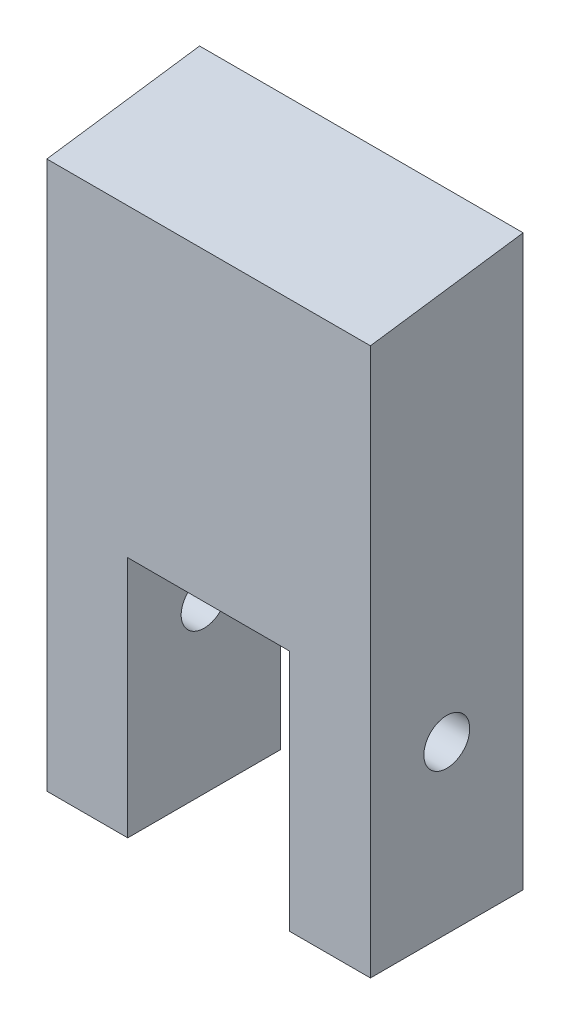
ISO-10303-21;
HEADER;
FILE_DESCRIPTION(('STEP AP214'),'2;1');
FILE_NAME('part.step','',(''),(''),'','','');
FILE_SCHEMA(('AUTOMOTIVE_DESIGN { 1 0 10303 214 1 1 1 1 }'));
ENDSEC;
DATA;
#1=APPLICATION_CONTEXT('core data for automotive mechanical design processes');
#2=APPLICATION_PROTOCOL_DEFINITION('international standard','automotive_design',2000,#1);
#3=PRODUCT_CONTEXT('',#1,'mechanical');
#4=PRODUCT('Part','Part','',(#3));
#5=PRODUCT_RELATED_PRODUCT_CATEGORY('part','',(#4));
#6=PRODUCT_DEFINITION_FORMATION('','',#4);
#7=PRODUCT_DEFINITION_CONTEXT('part definition',#1,'design');
#8=PRODUCT_DEFINITION('design','',#6,#7);
#9=PRODUCT_DEFINITION_SHAPE('','',#8);
#10=(LENGTH_UNIT() NAMED_UNIT(*) SI_UNIT(.MILLI.,.METRE.));
#11=(NAMED_UNIT(*) PLANE_ANGLE_UNIT() SI_UNIT($,.RADIAN.));
#12=(NAMED_UNIT(*) SI_UNIT($,.STERADIAN.) SOLID_ANGLE_UNIT());
#13=UNCERTAINTY_MEASURE_WITH_UNIT(LENGTH_MEASURE(1.E-05),#10,'distance_accuracy_value','');
#14=(GEOMETRIC_REPRESENTATION_CONTEXT(3) GLOBAL_UNCERTAINTY_ASSIGNED_CONTEXT((#13)) GLOBAL_UNIT_ASSIGNED_CONTEXT((#10,
#11,#12)) REPRESENTATION_CONTEXT('',''));
#15=CARTESIAN_POINT('',(0.,0.,0.));
#16=DIRECTION('',(0.,0.,1.));
#17=DIRECTION('',(1.,0.,0.));
#18=AXIS2_PLACEMENT_3D('',#15,#16,#17);
#19=CARTESIAN_POINT('',(25.4,0.,0.));
#20=DIRECTION('',(0.,1.,0.));
#21=DIRECTION('',(0.,0.,1.));
#22=AXIS2_PLACEMENT_3D('',#19,#20,#21);
#23=PLANE('',#22);
#24=DIRECTION('',(-1.,0.,0.));
#25=VECTOR('',#24,1.);
#26=CARTESIAN_POINT('',(25.4,0.,0.));
#27=LINE('',#26,#25);
#28=CARTESIAN_POINT('',(25.4,0.,0.));
#29=VERTEX_POINT('',#28);
#30=CARTESIAN_POINT('',(19.05,0.,0.));
#31=VERTEX_POINT('',#30);
#32=EDGE_CURVE('E11',#29,#31,#27,.T.);
#33=ORIENTED_EDGE('',*,*,#32,.T.);
#34=DIRECTION('',(0.,0.,1.));
#35=VECTOR('',#34,1.);
#36=CARTESIAN_POINT('',(19.05,0.,-11.9888));
#37=LINE('',#36,#35);
#38=CARTESIAN_POINT('',(19.05,0.,-11.9888));
#39=VERTEX_POINT('',#38);
#40=EDGE_CURVE('E153',#39,#31,#37,.T.);
#41=ORIENTED_EDGE('',*,*,#40,.F.);
#42=DIRECTION('',(-1.,0.,0.));
#43=VECTOR('',#42,1.);
#44=CARTESIAN_POINT('',(25.4,0.,-11.9888));
#45=LINE('',#44,#43);
#46=CARTESIAN_POINT('',(25.4,0.,-11.9888));
#47=VERTEX_POINT('',#46);
#48=EDGE_CURVE('E136',#47,#39,#45,.T.);
#49=ORIENTED_EDGE('',*,*,#48,.F.);
#50=DIRECTION('',(0.,0.,-1.));
#51=VECTOR('',#50,1.);
#52=CARTESIAN_POINT('',(25.4,0.,0.));
#53=LINE('',#52,#51);
#54=EDGE_CURVE('E92',#29,#47,#53,.T.);
#55=ORIENTED_EDGE('',*,*,#54,.F.);
#56=EDGE_LOOP('',(#33,#41,#49,#55));
#57=FACE_BOUND('',#56,.T.);
#58=ADVANCED_FACE('F39',(#57),#23,.F.);
#59=CARTESIAN_POINT('',(25.4,42.9782303930708,0.));
#60=DIRECTION('',(0.,0.,-1.));
#61=DIRECTION('',(0.,1.,0.));
#62=AXIS2_PLACEMENT_3D('',#59,#60,#61);
#63=PLANE('',#62);
#64=DIRECTION('',(-1.,0.,0.));
#65=VECTOR('',#64,1.);
#66=CARTESIAN_POINT('',(6.34999999999999,19.05,0.));
#67=LINE('',#66,#65);
#68=CARTESIAN_POINT('',(19.05,19.05,0.));
#69=VERTEX_POINT('',#68);
#70=CARTESIAN_POINT('',(6.34999999999999,19.05,0.));
#71=VERTEX_POINT('',#70);
#72=EDGE_CURVE('E141',#69,#71,#67,.T.);
#73=ORIENTED_EDGE('',*,*,#72,.F.);
#74=DIRECTION('',(0.,1.,0.));
#75=VECTOR('',#74,1.);
#76=CARTESIAN_POINT('',(19.05,19.05,0.));
#77=LINE('',#76,#75);
#78=EDGE_CURVE('E120',#31,#69,#77,.T.);
#79=ORIENTED_EDGE('',*,*,#78,.F.);
#80=ORIENTED_EDGE('',*,*,#32,.F.);
#81=DIRECTION('',(0.,-1.,0.));
#82=VECTOR('',#81,1.);
#83=CARTESIAN_POINT('',(25.4,42.9782303930708,0.));
#84=LINE('',#83,#82);
#85=CARTESIAN_POINT('',(25.4,42.9782303930708,0.));
#86=VERTEX_POINT('',#85);
#87=EDGE_CURVE('E163',#86,#29,#84,.T.);
#88=ORIENTED_EDGE('',*,*,#87,.F.);
#89=DIRECTION('',(-1.,0.,0.));
#90=VECTOR('',#89,1.);
#91=CARTESIAN_POINT('',(25.4,42.9782303930708,0.));
#92=LINE('',#91,#90);
#93=CARTESIAN_POINT('',(0.,42.9782303930708,0.));
#94=VERTEX_POINT('',#93);
#95=EDGE_CURVE('E173',#86,#94,#92,.T.);
#96=ORIENTED_EDGE('',*,*,#95,.T.);
#97=DIRECTION('',(0.,-1.,0.));
#98=VECTOR('',#97,1.);
#99=CARTESIAN_POINT('',(0.,42.9782303930708,0.));
#100=LINE('',#99,#98);
#101=CARTESIAN_POINT('',(0.,0.,0.));
#102=VERTEX_POINT('',#101);
#103=EDGE_CURVE('E156',#94,#102,#100,.T.);
#104=ORIENTED_EDGE('',*,*,#103,.T.);
#105=CARTESIAN_POINT('',(6.35,0.,0.));
#106=VERTEX_POINT('',#105);
#107=EDGE_CURVE('E48',#106,#102,#27,.T.);
#108=ORIENTED_EDGE('',*,*,#107,.F.);
#109=DIRECTION('',(0.,-1.,0.));
#110=VECTOR('',#109,1.);
#111=CARTESIAN_POINT('',(6.34999999999999,19.05,0.));
#112=LINE('',#111,#110);
#113=EDGE_CURVE('E138',#71,#106,#112,.T.);
#114=ORIENTED_EDGE('',*,*,#113,.F.);
#115=EDGE_LOOP('',(#73,#79,#80,#88,#96,#104,#108,#114));
#116=FACE_BOUND('',#115,.T.);
#117=ADVANCED_FACE('F41',(#116),#63,.F.);
#118=CARTESIAN_POINT('',(6.35,0.,-11.9888));
#119=VERTEX_POINT('',#118);
#120=CARTESIAN_POINT('',(0.,0.,-11.9888));
#121=VERTEX_POINT('',#120);
#122=EDGE_CURVE('E190',#119,#121,#45,.T.);
#123=ORIENTED_EDGE('',*,*,#122,.F.);
#124=DIRECTION('',(0.,0.,1.));
#125=VECTOR('',#124,1.);
#126=CARTESIAN_POINT('',(6.35,0.,-11.9888));
#127=LINE('',#126,#125);
#128=EDGE_CURVE('E157',#119,#106,#127,.T.);
#129=ORIENTED_EDGE('',*,*,#128,.T.);
#130=ORIENTED_EDGE('',*,*,#107,.T.);
#131=DIRECTION('',(0.,0.,-1.));
#132=VECTOR('',#131,1.);
#133=CARTESIAN_POINT('',(0.,0.,0.));
#134=LINE('',#133,#132);
#135=EDGE_CURVE('E177',#102,#121,#134,.T.);
#136=ORIENTED_EDGE('',*,*,#135,.T.);
#137=EDGE_LOOP('',(#123,#129,#130,#136));
#138=FACE_BOUND('',#137,.T.);
#139=ADVANCED_FACE('F199',(#138),#23,.F.);
#140=CARTESIAN_POINT('',(25.4,0.,-11.9888));
#141=DIRECTION('',(0.,0.,1.));
#142=DIRECTION('',(1.,0.,0.));
#143=AXIS2_PLACEMENT_3D('',#140,#141,#142);
#144=PLANE('',#143);
#145=ORIENTED_EDGE('',*,*,#48,.T.);
#146=DIRECTION('',(0.,1.,0.));
#147=VECTOR('',#146,1.);
#148=CARTESIAN_POINT('',(19.05,19.05,-11.9888));
#149=LINE('',#148,#147);
#150=CARTESIAN_POINT('',(19.05,19.05,-11.9888));
#151=VERTEX_POINT('',#150);
#152=EDGE_CURVE('E117',#39,#151,#149,.T.);
#153=ORIENTED_EDGE('',*,*,#152,.T.);
#154=DIRECTION('',(-1.,0.,0.));
#155=VECTOR('',#154,1.);
#156=CARTESIAN_POINT('',(6.34999999999999,19.05,-11.9888));
#157=LINE('',#156,#155);
#158=CARTESIAN_POINT('',(6.34999999999999,19.05,-11.9888));
#159=VERTEX_POINT('',#158);
#160=EDGE_CURVE('E128',#151,#159,#157,.T.);
#161=ORIENTED_EDGE('',*,*,#160,.T.);
#162=DIRECTION('',(0.,-1.,0.));
#163=VECTOR('',#162,1.);
#164=CARTESIAN_POINT('',(6.34999999999999,19.05,-11.9888));
#165=LINE('',#164,#163);
#166=EDGE_CURVE('E55',#159,#119,#165,.T.);
#167=ORIENTED_EDGE('',*,*,#166,.T.);
#168=ORIENTED_EDGE('',*,*,#122,.T.);
#169=DIRECTION('',(0.,1.,0.));
#170=VECTOR('',#169,1.);
#171=CARTESIAN_POINT('',(0.,0.,-11.9888));
#172=LINE('',#171,#170);
#173=CARTESIAN_POINT('',(0.,44.6631463521507,-11.9888));
#174=VERTEX_POINT('',#173);
#175=EDGE_CURVE('E181',#121,#174,#172,.T.);
#176=ORIENTED_EDGE('',*,*,#175,.T.);
#177=DIRECTION('',(-1.,0.,0.));
#178=VECTOR('',#177,1.);
#179=CARTESIAN_POINT('',(25.4,44.6631463521507,-11.9888));
#180=LINE('',#179,#178);
#181=CARTESIAN_POINT('',(25.4,44.6631463521507,-11.9888));
#182=VERTEX_POINT('',#181);
#183=EDGE_CURVE('E188',#182,#174,#180,.T.);
#184=ORIENTED_EDGE('',*,*,#183,.F.);
#185=DIRECTION('',(0.,1.,0.));
#186=VECTOR('',#185,1.);
#187=CARTESIAN_POINT('',(25.4,0.,-11.9888));
#188=LINE('',#187,#186);
#189=EDGE_CURVE('E168',#47,#182,#188,.T.);
#190=ORIENTED_EDGE('',*,*,#189,.F.);
#191=EDGE_LOOP('',(#145,#153,#161,#167,#168,#176,#184,#190));
#192=FACE_BOUND('',#191,.T.);
#193=ADVANCED_FACE('F134',(#192),#144,.F.);
#194=CARTESIAN_POINT('',(25.4,44.6631463521507,-11.9888));
#195=DIRECTION('',(0.,-0.990268068741571,-0.139173100960059));
#196=DIRECTION('',(0.,0.139173100960059,-0.990268068741571));
#197=AXIS2_PLACEMENT_3D('',#194,#195,#196);
#198=PLANE('',#197);
#199=DIRECTION('',(0.,-0.139173100960059,0.990268068741571));
#200=VECTOR('',#199,1.);
#201=CARTESIAN_POINT('',(0.,44.6631463521507,-11.9888));
#202=LINE('',#201,#200);
#203=EDGE_CURVE('E85',#174,#94,#202,.T.);
#204=ORIENTED_EDGE('',*,*,#203,.T.);
#205=ORIENTED_EDGE('',*,*,#95,.F.);
#206=DIRECTION('',(0.,-0.139173100960059,0.990268068741571));
#207=VECTOR('',#206,1.);
#208=CARTESIAN_POINT('',(25.4,44.6631463521507,-11.9888));
#209=LINE('',#208,#207);
#210=EDGE_CURVE('E64',#182,#86,#209,.T.);
#211=ORIENTED_EDGE('',*,*,#210,.F.);
#212=ORIENTED_EDGE('',*,*,#183,.T.);
#213=EDGE_LOOP('',(#204,#205,#211,#212));
#214=FACE_BOUND('',#213,.T.);
#215=ADVANCED_FACE('F208',(#214),#198,.F.);
#216=CARTESIAN_POINT('',(25.4,0.,0.));
#217=DIRECTION('',(1.,0.,0.));
#218=DIRECTION('',(0.,0.,-1.));
#219=AXIS2_PLACEMENT_3D('',#216,#217,#218);
#220=PLANE('',#219);
#221=CARTESIAN_POINT('',(25.4,13.0556,-5.9944));
#222=DIRECTION('',(1.,0.,0.));
#223=DIRECTION('',(0.,0.,-1.));
#224=AXIS2_PLACEMENT_3D('',#221,#222,#223);
#225=CIRCLE('',#224,1.79999999999999);
#226=CARTESIAN_POINT('',(25.4,13.0556,-7.79439999999999));
#227=VERTEX_POINT('',#226);
#228=EDGE_CURVE('E247',#227,#227,#225,.T.);
#229=ORIENTED_EDGE('',*,*,#228,.F.);
#230=EDGE_LOOP('',(#229));
#231=FACE_BOUND('',#230,.T.);
#232=ORIENTED_EDGE('',*,*,#87,.T.);
#233=ORIENTED_EDGE('',*,*,#54,.T.);
#234=ORIENTED_EDGE('',*,*,#189,.T.);
#235=ORIENTED_EDGE('',*,*,#210,.T.);
#236=EDGE_LOOP('',(#232,#233,#234,#235));
#237=FACE_BOUND('',#236,.T.);
#238=ADVANCED_FACE('F209',(#231,#237),#220,.T.);
#239=CARTESIAN_POINT('',(0.,0.,0.));
#240=DIRECTION('',(1.,0.,0.));
#241=DIRECTION('',(0.,0.,-1.));
#242=AXIS2_PLACEMENT_3D('',#239,#240,#241);
#243=PLANE('',#242);
#244=CARTESIAN_POINT('',(0.,13.0556,-5.9944));
#245=DIRECTION('',(1.,0.,0.));
#246=DIRECTION('',(0.,0.,-1.));
#247=AXIS2_PLACEMENT_3D('',#244,#245,#246);
#248=CIRCLE('',#247,1.79999999999999);
#249=CARTESIAN_POINT('',(0.,13.0556,-7.79439999999999));
#250=VERTEX_POINT('',#249);
#251=EDGE_CURVE('E250',#250,#250,#248,.T.);
#252=ORIENTED_EDGE('',*,*,#251,.T.);
#253=EDGE_LOOP('',(#252));
#254=FACE_BOUND('',#253,.T.);
#255=ORIENTED_EDGE('',*,*,#103,.F.);
#256=ORIENTED_EDGE('',*,*,#203,.F.);
#257=ORIENTED_EDGE('',*,*,#175,.F.);
#258=ORIENTED_EDGE('',*,*,#135,.F.);
#259=EDGE_LOOP('',(#255,#256,#257,#258));
#260=FACE_BOUND('',#259,.T.);
#261=ADVANCED_FACE('F203',(#254,#260),#243,.F.);
#262=CARTESIAN_POINT('',(19.05,19.05,-11.9888));
#263=DIRECTION('',(1.,0.,0.));
#264=DIRECTION('',(0.,1.,0.));
#265=AXIS2_PLACEMENT_3D('',#262,#263,#264);
#266=PLANE('',#265);
#267=CARTESIAN_POINT('',(19.05,13.0556,-5.9944));
#268=DIRECTION('',(1.,0.,0.));
#269=DIRECTION('',(0.,1.,0.));
#270=AXIS2_PLACEMENT_3D('',#267,#268,#269);
#271=CIRCLE('',#270,1.79999999999999);
#272=CARTESIAN_POINT('',(19.05,14.8556,-5.9944));
#273=VERTEX_POINT('',#272);
#274=EDGE_CURVE('E254',#273,#273,#271,.T.);
#275=ORIENTED_EDGE('',*,*,#274,.T.);
#276=EDGE_LOOP('',(#275));
#277=FACE_BOUND('',#276,.T.);
#278=ORIENTED_EDGE('',*,*,#78,.T.);
#279=DIRECTION('',(0.,0.,1.));
#280=VECTOR('',#279,1.);
#281=CARTESIAN_POINT('',(19.05,19.05,-11.9888));
#282=LINE('',#281,#280);
#283=EDGE_CURVE('E113',#151,#69,#282,.T.);
#284=ORIENTED_EDGE('',*,*,#283,.F.);
#285=ORIENTED_EDGE('',*,*,#152,.F.);
#286=ORIENTED_EDGE('',*,*,#40,.T.);
#287=EDGE_LOOP('',(#278,#284,#285,#286));
#288=FACE_BOUND('',#287,.T.);
#289=ADVANCED_FACE('F115',(#277,#288),#266,.F.);
#290=CARTESIAN_POINT('',(6.34999999999999,19.05,-11.9888));
#291=DIRECTION('',(-1.,0.,0.));
#292=DIRECTION('',(0.,-1.,0.));
#293=AXIS2_PLACEMENT_3D('',#290,#291,#292);
#294=PLANE('',#293);
#295=CARTESIAN_POINT('',(6.34999999999999,13.0556,-5.9944));
#296=DIRECTION('',(-1.,0.,0.));
#297=DIRECTION('',(0.,-1.,0.));
#298=AXIS2_PLACEMENT_3D('',#295,#296,#297);
#299=CIRCLE('',#298,1.79999999999999);
#300=CARTESIAN_POINT('',(6.34999999999999,11.2556,-5.9944));
#301=VERTEX_POINT('',#300);
#302=EDGE_CURVE('E144',#301,#301,#299,.T.);
#303=ORIENTED_EDGE('',*,*,#302,.T.);
#304=EDGE_LOOP('',(#303));
#305=FACE_BOUND('',#304,.T.);
#306=ORIENTED_EDGE('',*,*,#113,.T.);
#307=ORIENTED_EDGE('',*,*,#128,.F.);
#308=ORIENTED_EDGE('',*,*,#166,.F.);
#309=DIRECTION('',(0.,0.,1.));
#310=VECTOR('',#309,1.);
#311=CARTESIAN_POINT('',(6.34999999999999,19.05,-11.9888));
#312=LINE('',#311,#310);
#313=EDGE_CURVE('E125',#159,#71,#312,.T.);
#314=ORIENTED_EDGE('',*,*,#313,.T.);
#315=EDGE_LOOP('',(#306,#307,#308,#314));
#316=FACE_BOUND('',#315,.T.);
#317=ADVANCED_FACE('F210',(#305,#316),#294,.F.);
#318=CARTESIAN_POINT('',(6.34999999999999,19.05,-11.9888));
#319=DIRECTION('',(0.,1.,0.));
#320=DIRECTION('',(-1.,0.,0.));
#321=AXIS2_PLACEMENT_3D('',#318,#319,#320);
#322=PLANE('',#321);
#323=ORIENTED_EDGE('',*,*,#72,.T.);
#324=ORIENTED_EDGE('',*,*,#313,.F.);
#325=ORIENTED_EDGE('',*,*,#160,.F.);
#326=ORIENTED_EDGE('',*,*,#283,.T.);
#327=EDGE_LOOP('',(#323,#324,#325,#326));
#328=FACE_BOUND('',#327,.T.);
#329=ADVANCED_FACE('F129',(#328),#322,.F.);
#330=CARTESIAN_POINT('',(25.4,13.0556,-5.9944));
#331=DIRECTION('',(1.,0.,0.));
#332=DIRECTION('',(0.,0.,-1.));
#333=AXIS2_PLACEMENT_3D('',#330,#331,#332);
#334=CYLINDRICAL_SURFACE('',#333,1.79999999999999);
#335=ORIENTED_EDGE('',*,*,#251,.F.);
#336=EDGE_LOOP('',(#335));
#337=FACE_BOUND('',#336,.T.);
#338=ORIENTED_EDGE('',*,*,#302,.F.);
#339=EDGE_LOOP('',(#338));
#340=FACE_BOUND('',#339,.T.);
#341=ADVANCED_FACE('F218',(#337,#340),#334,.F.);
#342=ORIENTED_EDGE('',*,*,#228,.T.);
#343=EDGE_LOOP('',(#342));
#344=FACE_BOUND('',#343,.T.);
#345=ORIENTED_EDGE('',*,*,#274,.F.);
#346=EDGE_LOOP('',(#345));
#347=FACE_BOUND('',#346,.T.);
#348=ADVANCED_FACE('F263',(#344,#347),#334,.F.);
#349=CLOSED_SHELL('',(#58,#117,#139,#193,#215,#238,#261,#289,#317,#329,#341,#348));
#350=MANIFOLD_SOLID_BREP('B2',#349);
#351=ADVANCED_BREP_SHAPE_REPRESENTATION('',(#18,#350),#14);
#352=SHAPE_DEFINITION_REPRESENTATION(#9,#351);
ENDSEC;
END-ISO-10303-21;
